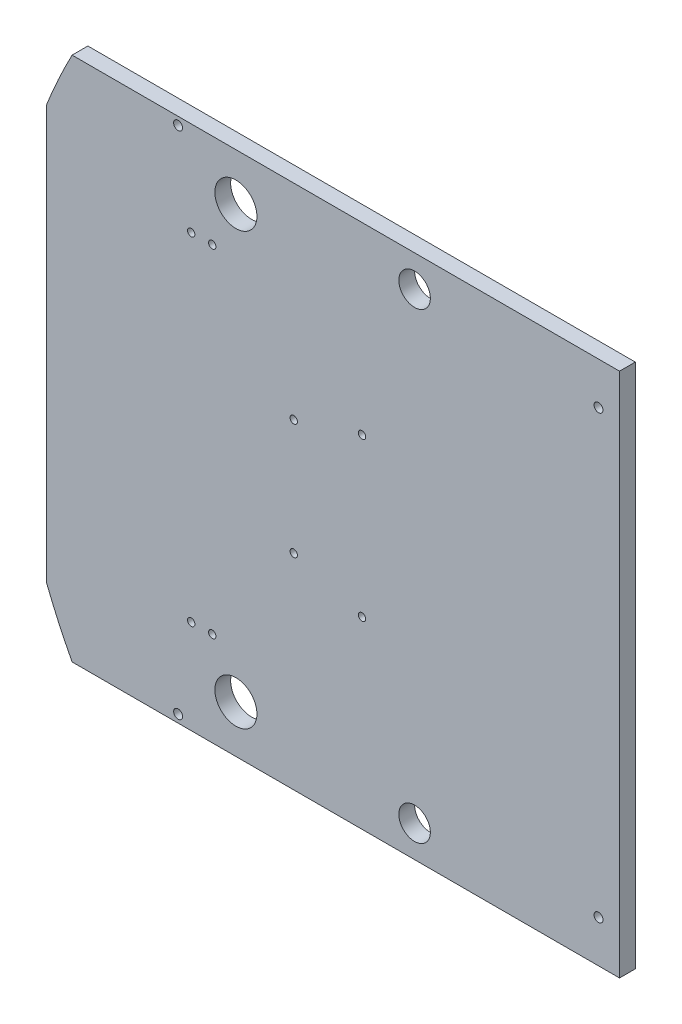
ISO-10303-21;
HEADER;
FILE_DESCRIPTION(('STEP AP214'),'2;1');
FILE_NAME('part.step','',(''),(''),'','','');
FILE_SCHEMA(('AUTOMOTIVE_DESIGN { 1 0 10303 214 1 1 1 1 }'));
ENDSEC;
DATA;
#1=APPLICATION_CONTEXT('core data for automotive mechanical design processes');
#2=APPLICATION_PROTOCOL_DEFINITION('international standard','automotive_design',2000,#1);
#3=PRODUCT_CONTEXT('',#1,'mechanical');
#4=PRODUCT('Part','Part','',(#3));
#5=PRODUCT_RELATED_PRODUCT_CATEGORY('part','',(#4));
#6=PRODUCT_DEFINITION_FORMATION('','',#4);
#7=PRODUCT_DEFINITION_CONTEXT('part definition',#1,'design');
#8=PRODUCT_DEFINITION('design','',#6,#7);
#9=PRODUCT_DEFINITION_SHAPE('','',#8);
#10=(LENGTH_UNIT() NAMED_UNIT(*) SI_UNIT(.MILLI.,.METRE.));
#11=(NAMED_UNIT(*) PLANE_ANGLE_UNIT() SI_UNIT($,.RADIAN.));
#12=(NAMED_UNIT(*) SI_UNIT($,.STERADIAN.) SOLID_ANGLE_UNIT());
#13=UNCERTAINTY_MEASURE_WITH_UNIT(LENGTH_MEASURE(1.E-05),#10,'distance_accuracy_value','');
#14=(GEOMETRIC_REPRESENTATION_CONTEXT(3) GLOBAL_UNCERTAINTY_ASSIGNED_CONTEXT((#13)) GLOBAL_UNIT_ASSIGNED_CONTEXT((#10,
#11,#12)) REPRESENTATION_CONTEXT('',''));
#15=CARTESIAN_POINT('',(0.,0.,0.));
#16=DIRECTION('',(0.,0.,1.));
#17=DIRECTION('',(1.,0.,0.));
#18=AXIS2_PLACEMENT_3D('',#15,#16,#17);
#19=CARTESIAN_POINT('',(10.,84.,239.3));
#20=DIRECTION('',(0.,0.,1.));
#21=DIRECTION('',(1.,0.,0.));
#22=AXIS2_PLACEMENT_3D('',#19,#20,#21);
#23=CYLINDRICAL_SURFACE('',#22,1.7);
#24=DIRECTION('',(0.,0.,1.));
#25=VECTOR('',#24,1.);
#26=CARTESIAN_POINT('',(11.7,84.,239.3));
#27=LINE('',#26,#25);
#28=CARTESIAN_POINT('',(11.7,84.,239.5));
#29=VERTEX_POINT('',#28);
#30=CARTESIAN_POINT('',(11.7,84.,245.5));
#31=VERTEX_POINT('',#30);
#32=EDGE_CURVE('E10',#29,#31,#27,.T.);
#33=ORIENTED_EDGE('',*,*,#32,.F.);
#34=CARTESIAN_POINT('',(10.,84.,239.5));
#35=DIRECTION('',(0.,0.,1.));
#36=DIRECTION('',(1.,0.,0.));
#37=AXIS2_PLACEMENT_3D('',#34,#35,#36);
#38=CIRCLE('',#37,1.7);
#39=EDGE_CURVE('E304',#29,#29,#38,.T.);
#40=ORIENTED_EDGE('',*,*,#39,.F.);
#41=ORIENTED_EDGE('',*,*,#32,.T.);
#42=CARTESIAN_POINT('',(10.,84.,245.5));
#43=DIRECTION('',(0.,0.,1.));
#44=DIRECTION('',(1.,0.,0.));
#45=AXIS2_PLACEMENT_3D('',#42,#43,#44);
#46=CIRCLE('',#45,1.7);
#47=EDGE_CURVE('E215',#31,#31,#46,.T.);
#48=ORIENTED_EDGE('',*,*,#47,.T.);
#49=EDGE_LOOP('',(#33,#40,#41,#48));
#50=FACE_BOUND('',#49,.T.);
#51=ADVANCED_FACE('F15',(#50),#23,.F.);
#52=CARTESIAN_POINT('',(-60.,88.,239.3));
#53=DIRECTION('',(0.,0.,1.));
#54=DIRECTION('',(1.,0.,0.));
#55=AXIS2_PLACEMENT_3D('',#52,#53,#54);
#56=CYLINDRICAL_SURFACE('',#55,6.);
#57=DIRECTION('',(0.,0.,1.));
#58=VECTOR('',#57,1.);
#59=CARTESIAN_POINT('',(-54.,88.,239.3));
#60=LINE('',#59,#58);
#61=CARTESIAN_POINT('',(-54.,88.,239.5));
#62=VERTEX_POINT('',#61);
#63=CARTESIAN_POINT('',(-54.,88.,245.5));
#64=VERTEX_POINT('',#63);
#65=EDGE_CURVE('E26',#62,#64,#60,.T.);
#66=ORIENTED_EDGE('',*,*,#65,.F.);
#67=CARTESIAN_POINT('',(-60.,88.,239.5));
#68=DIRECTION('',(0.,0.,1.));
#69=DIRECTION('',(1.,0.,0.));
#70=AXIS2_PLACEMENT_3D('',#67,#68,#69);
#71=CIRCLE('',#70,6.);
#72=EDGE_CURVE('E300',#62,#62,#71,.T.);
#73=ORIENTED_EDGE('',*,*,#72,.F.);
#74=ORIENTED_EDGE('',*,*,#65,.T.);
#75=CARTESIAN_POINT('',(-60.,88.,245.5));
#76=DIRECTION('',(0.,0.,1.));
#77=DIRECTION('',(1.,0.,0.));
#78=AXIS2_PLACEMENT_3D('',#75,#76,#77);
#79=CIRCLE('',#78,6.);
#80=EDGE_CURVE('E237',#64,#64,#79,.T.);
#81=ORIENTED_EDGE('',*,*,#80,.T.);
#82=EDGE_LOOP('',(#66,#73,#74,#81));
#83=FACE_BOUND('',#82,.T.);
#84=ADVANCED_FACE('F687',(#83),#56,.F.);
#85=CARTESIAN_POINT('',(-128.,82.,239.3));
#86=DIRECTION('',(0.,0.,1.));
#87=DIRECTION('',(1.,0.,0.));
#88=AXIS2_PLACEMENT_3D('',#85,#86,#87);
#89=CYLINDRICAL_SURFACE('',#88,8.);
#90=DIRECTION('',(0.,0.,1.));
#91=VECTOR('',#90,1.);
#92=CARTESIAN_POINT('',(-120.,82.,239.3));
#93=LINE('',#92,#91);
#94=CARTESIAN_POINT('',(-120.,82.,239.5));
#95=VERTEX_POINT('',#94);
#96=CARTESIAN_POINT('',(-120.,82.,245.5));
#97=VERTEX_POINT('',#96);
#98=EDGE_CURVE('E419',#95,#97,#93,.T.);
#99=ORIENTED_EDGE('',*,*,#98,.F.);
#100=CARTESIAN_POINT('',(-128.,82.,239.5));
#101=DIRECTION('',(0.,0.,1.));
#102=DIRECTION('',(1.,0.,0.));
#103=AXIS2_PLACEMENT_3D('',#100,#101,#102);
#104=CIRCLE('',#103,8.);
#105=EDGE_CURVE('E296',#95,#95,#104,.T.);
#106=ORIENTED_EDGE('',*,*,#105,.F.);
#107=ORIENTED_EDGE('',*,*,#98,.T.);
#108=CARTESIAN_POINT('',(-128.,82.,245.5));
#109=DIRECTION('',(0.,0.,1.));
#110=DIRECTION('',(1.,0.,0.));
#111=AXIS2_PLACEMENT_3D('',#108,#109,#110);
#112=CIRCLE('',#111,8.);
#113=EDGE_CURVE('E241',#97,#97,#112,.T.);
#114=ORIENTED_EDGE('',*,*,#113,.T.);
#115=EDGE_LOOP('',(#99,#106,#107,#114));
#116=FACE_BOUND('',#115,.T.);
#117=ADVANCED_FACE('F692',(#116),#89,.F.);
#118=CARTESIAN_POINT('',(-150.,97.,239.3));
#119=DIRECTION('',(0.,0.,1.));
#120=DIRECTION('',(1.,0.,0.));
#121=AXIS2_PLACEMENT_3D('',#118,#119,#120);
#122=CYLINDRICAL_SURFACE('',#121,1.7);
#123=DIRECTION('',(0.,0.,1.));
#124=VECTOR('',#123,1.);
#125=CARTESIAN_POINT('',(-148.3,97.,239.3));
#126=LINE('',#125,#124);
#127=CARTESIAN_POINT('',(-148.3,97.,239.5));
#128=VERTEX_POINT('',#127);
#129=CARTESIAN_POINT('',(-148.3,97.,245.5));
#130=VERTEX_POINT('',#129);
#131=EDGE_CURVE('E420',#128,#130,#126,.T.);
#132=ORIENTED_EDGE('',*,*,#131,.F.);
#133=CARTESIAN_POINT('',(-150.,97.,239.5));
#134=DIRECTION('',(0.,0.,1.));
#135=DIRECTION('',(1.,0.,0.));
#136=AXIS2_PLACEMENT_3D('',#133,#134,#135);
#137=CIRCLE('',#136,1.7);
#138=EDGE_CURVE('E252',#128,#128,#137,.T.);
#139=ORIENTED_EDGE('',*,*,#138,.F.);
#140=ORIENTED_EDGE('',*,*,#131,.T.);
#141=CARTESIAN_POINT('',(-150.,97.,245.5));
#142=DIRECTION('',(0.,0.,1.));
#143=DIRECTION('',(1.,0.,0.));
#144=AXIS2_PLACEMENT_3D('',#141,#142,#143);
#145=CIRCLE('',#144,1.7);
#146=EDGE_CURVE('E341',#130,#130,#145,.T.);
#147=ORIENTED_EDGE('',*,*,#146,.T.);
#148=EDGE_LOOP('',(#132,#139,#140,#147));
#149=FACE_BOUND('',#148,.T.);
#150=ADVANCED_FACE('F720',(#149),#122,.F.);
#151=CARTESIAN_POINT('',(-137.,64.2,239.4));
#152=DIRECTION('',(0.,0.,1.));
#153=DIRECTION('',(1.,0.,0.));
#154=AXIS2_PLACEMENT_3D('',#151,#152,#153);
#155=CYLINDRICAL_SURFACE('',#154,1.4);
#156=DIRECTION('',(0.,0.,1.));
#157=VECTOR('',#156,1.);
#158=CARTESIAN_POINT('',(-135.6,64.2,239.4));
#159=LINE('',#158,#157);
#160=CARTESIAN_POINT('',(-135.6,64.2,239.5));
#161=VERTEX_POINT('',#160);
#162=CARTESIAN_POINT('',(-135.6,64.2,245.5));
#163=VERTEX_POINT('',#162);
#164=EDGE_CURVE('E409',#161,#163,#159,.T.);
#165=ORIENTED_EDGE('',*,*,#164,.F.);
#166=CARTESIAN_POINT('',(-137.,64.2,239.5));
#167=DIRECTION('',(0.,0.,1.));
#168=DIRECTION('',(1.,0.,0.));
#169=AXIS2_PLACEMENT_3D('',#166,#167,#168);
#170=CIRCLE('',#169,1.4);
#171=EDGE_CURVE('E248',#161,#161,#170,.T.);
#172=ORIENTED_EDGE('',*,*,#171,.F.);
#173=ORIENTED_EDGE('',*,*,#164,.T.);
#174=CARTESIAN_POINT('',(-137.,64.2,245.5));
#175=DIRECTION('',(0.,0.,1.));
#176=DIRECTION('',(1.,0.,0.));
#177=AXIS2_PLACEMENT_3D('',#174,#175,#176);
#178=CIRCLE('',#177,1.4);
#179=EDGE_CURVE('E220',#163,#163,#178,.T.);
#180=ORIENTED_EDGE('',*,*,#179,.T.);
#181=EDGE_LOOP('',(#165,#172,#173,#180));
#182=FACE_BOUND('',#181,.T.);
#183=ADVANCED_FACE('F716',(#182),#155,.F.);
#184=CARTESIAN_POINT('',(-145.,64.2,239.4));
#185=DIRECTION('',(0.,0.,1.));
#186=DIRECTION('',(1.,0.,0.));
#187=AXIS2_PLACEMENT_3D('',#184,#185,#186);
#188=CYLINDRICAL_SURFACE('',#187,1.4);
#189=DIRECTION('',(0.,0.,1.));
#190=VECTOR('',#189,1.);
#191=CARTESIAN_POINT('',(-143.6,64.2,239.4));
#192=LINE('',#191,#190);
#193=CARTESIAN_POINT('',(-143.6,64.2,239.5));
#194=VERTEX_POINT('',#193);
#195=CARTESIAN_POINT('',(-143.6,64.2,245.5));
#196=VERTEX_POINT('',#195);
#197=EDGE_CURVE('E406',#194,#196,#192,.T.);
#198=ORIENTED_EDGE('',*,*,#197,.F.);
#199=CARTESIAN_POINT('',(-145.,64.2,239.5));
#200=DIRECTION('',(0.,0.,1.));
#201=DIRECTION('',(1.,0.,0.));
#202=AXIS2_PLACEMENT_3D('',#199,#200,#201);
#203=CIRCLE('',#202,1.4);
#204=EDGE_CURVE('E253',#194,#194,#203,.T.);
#205=ORIENTED_EDGE('',*,*,#204,.F.);
#206=ORIENTED_EDGE('',*,*,#197,.T.);
#207=CARTESIAN_POINT('',(-145.,64.2,245.5));
#208=DIRECTION('',(0.,0.,1.));
#209=DIRECTION('',(1.,0.,0.));
#210=AXIS2_PLACEMENT_3D('',#207,#208,#209);
#211=CIRCLE('',#210,1.4);
#212=EDGE_CURVE('E216',#196,#196,#211,.T.);
#213=ORIENTED_EDGE('',*,*,#212,.T.);
#214=EDGE_LOOP('',(#198,#205,#206,#213));
#215=FACE_BOUND('',#214,.T.);
#216=ADVANCED_FACE('F719',(#215),#188,.F.);
#217=CARTESIAN_POINT('',(-80.,30.,239.4));
#218=DIRECTION('',(0.,0.,1.));
#219=DIRECTION('',(1.,0.,0.));
#220=AXIS2_PLACEMENT_3D('',#217,#218,#219);
#221=CYLINDRICAL_SURFACE('',#220,1.4);
#222=DIRECTION('',(0.,0.,1.));
#223=VECTOR('',#222,1.);
#224=CARTESIAN_POINT('',(-78.6,30.,239.4));
#225=LINE('',#224,#223);
#226=CARTESIAN_POINT('',(-78.6,30.,239.5));
#227=VERTEX_POINT('',#226);
#228=CARTESIAN_POINT('',(-78.6,30.,245.5));
#229=VERTEX_POINT('',#228);
#230=EDGE_CURVE('E369',#227,#229,#225,.T.);
#231=ORIENTED_EDGE('',*,*,#230,.F.);
#232=CARTESIAN_POINT('',(-80.,30.,239.5));
#233=DIRECTION('',(0.,0.,1.));
#234=DIRECTION('',(1.,0.,0.));
#235=AXIS2_PLACEMENT_3D('',#232,#233,#234);
#236=CIRCLE('',#235,1.4);
#237=EDGE_CURVE('E311',#227,#227,#236,.T.);
#238=ORIENTED_EDGE('',*,*,#237,.F.);
#239=ORIENTED_EDGE('',*,*,#230,.T.);
#240=CARTESIAN_POINT('',(-80.,30.,245.5));
#241=DIRECTION('',(0.,0.,1.));
#242=DIRECTION('',(1.,0.,0.));
#243=AXIS2_PLACEMENT_3D('',#240,#241,#242);
#244=CIRCLE('',#243,1.4);
#245=EDGE_CURVE('E221',#229,#229,#244,.T.);
#246=ORIENTED_EDGE('',*,*,#245,.T.);
#247=EDGE_LOOP('',(#231,#238,#239,#246));
#248=FACE_BOUND('',#247,.T.);
#249=ADVANCED_FACE('F529',(#248),#221,.F.);
#250=CARTESIAN_POINT('',(-106.,22.,239.4));
#251=DIRECTION('',(0.,0.,1.));
#252=DIRECTION('',(1.,0.,0.));
#253=AXIS2_PLACEMENT_3D('',#250,#251,#252);
#254=CYLINDRICAL_SURFACE('',#253,1.4);
#255=DIRECTION('',(0.,0.,1.));
#256=VECTOR('',#255,1.);
#257=CARTESIAN_POINT('',(-104.6,22.,239.4));
#258=LINE('',#257,#256);
#259=CARTESIAN_POINT('',(-104.6,22.,239.5));
#260=VERTEX_POINT('',#259);
#261=CARTESIAN_POINT('',(-104.6,22.,245.5));
#262=VERTEX_POINT('',#261);
#263=EDGE_CURVE('E295',#260,#262,#258,.T.);
#264=ORIENTED_EDGE('',*,*,#263,.F.);
#265=CARTESIAN_POINT('',(-106.,22.,239.5));
#266=DIRECTION('',(0.,0.,1.));
#267=DIRECTION('',(1.,0.,0.));
#268=AXIS2_PLACEMENT_3D('',#265,#266,#267);
#269=CIRCLE('',#268,1.4);
#270=EDGE_CURVE('E316',#260,#260,#269,.T.);
#271=ORIENTED_EDGE('',*,*,#270,.F.);
#272=ORIENTED_EDGE('',*,*,#263,.T.);
#273=CARTESIAN_POINT('',(-106.,22.,245.5));
#274=DIRECTION('',(0.,0.,1.));
#275=DIRECTION('',(1.,0.,0.));
#276=AXIS2_PLACEMENT_3D('',#273,#274,#275);
#277=CIRCLE('',#276,1.4);
#278=EDGE_CURVE('E362',#262,#262,#277,.T.);
#279=ORIENTED_EDGE('',*,*,#278,.T.);
#280=EDGE_LOOP('',(#264,#271,#272,#279));
#281=FACE_BOUND('',#280,.T.);
#282=ADVANCED_FACE('F740',(#281),#254,.F.);
#283=CARTESIAN_POINT('',(10.,-84.,239.3));
#284=DIRECTION('',(0.,0.,1.));
#285=DIRECTION('',(1.,0.,0.));
#286=AXIS2_PLACEMENT_3D('',#283,#284,#285);
#287=CYLINDRICAL_SURFACE('',#286,1.7);
#288=DIRECTION('',(0.,0.,1.));
#289=VECTOR('',#288,1.);
#290=CARTESIAN_POINT('',(11.7,-84.,239.3));
#291=LINE('',#290,#289);
#292=CARTESIAN_POINT('',(11.7,-84.,239.5));
#293=VERTEX_POINT('',#292);
#294=CARTESIAN_POINT('',(11.7,-84.,245.5));
#295=VERTEX_POINT('',#294);
#296=EDGE_CURVE('E292',#293,#295,#291,.T.);
#297=ORIENTED_EDGE('',*,*,#296,.F.);
#298=CARTESIAN_POINT('',(10.,-84.,239.5));
#299=DIRECTION('',(0.,0.,1.));
#300=DIRECTION('',(1.,0.,0.));
#301=AXIS2_PLACEMENT_3D('',#298,#299,#300);
#302=CIRCLE('',#301,1.7);
#303=EDGE_CURVE('E312',#293,#293,#302,.T.);
#304=ORIENTED_EDGE('',*,*,#303,.F.);
#305=ORIENTED_EDGE('',*,*,#296,.T.);
#306=CARTESIAN_POINT('',(10.,-84.,245.5));
#307=DIRECTION('',(0.,0.,1.));
#308=DIRECTION('',(1.,0.,0.));
#309=AXIS2_PLACEMENT_3D('',#306,#307,#308);
#310=CIRCLE('',#309,1.7);
#311=EDGE_CURVE('E257',#295,#295,#310,.T.);
#312=ORIENTED_EDGE('',*,*,#311,.T.);
#313=EDGE_LOOP('',(#297,#304,#305,#312));
#314=FACE_BOUND('',#313,.T.);
#315=ADVANCED_FACE('F736',(#314),#287,.F.);
#316=CARTESIAN_POINT('',(-60.,-88.,239.3));
#317=DIRECTION('',(0.,0.,1.));
#318=DIRECTION('',(1.,0.,0.));
#319=AXIS2_PLACEMENT_3D('',#316,#317,#318);
#320=CYLINDRICAL_SURFACE('',#319,6.);
#321=DIRECTION('',(0.,0.,1.));
#322=VECTOR('',#321,1.);
#323=CARTESIAN_POINT('',(-54.,-88.,239.3));
#324=LINE('',#323,#322);
#325=CARTESIAN_POINT('',(-54.,-88.,239.5));
#326=VERTEX_POINT('',#325);
#327=CARTESIAN_POINT('',(-54.,-88.,245.5));
#328=VERTEX_POINT('',#327);
#329=EDGE_CURVE('E196',#326,#328,#324,.T.);
#330=ORIENTED_EDGE('',*,*,#329,.F.);
#331=CARTESIAN_POINT('',(-60.,-88.,239.5));
#332=DIRECTION('',(0.,0.,1.));
#333=DIRECTION('',(1.,0.,0.));
#334=AXIS2_PLACEMENT_3D('',#331,#332,#333);
#335=CIRCLE('',#334,6.);
#336=EDGE_CURVE('E317',#326,#326,#335,.T.);
#337=ORIENTED_EDGE('',*,*,#336,.F.);
#338=ORIENTED_EDGE('',*,*,#329,.T.);
#339=CARTESIAN_POINT('',(-60.,-88.,245.5));
#340=DIRECTION('',(0.,0.,1.));
#341=DIRECTION('',(1.,0.,0.));
#342=AXIS2_PLACEMENT_3D('',#339,#340,#341);
#343=CIRCLE('',#342,6.);
#344=EDGE_CURVE('E254',#328,#328,#343,.T.);
#345=ORIENTED_EDGE('',*,*,#344,.T.);
#346=EDGE_LOOP('',(#330,#337,#338,#345));
#347=FACE_BOUND('',#346,.T.);
#348=ADVANCED_FACE('F739',(#347),#320,.F.);
#349=CARTESIAN_POINT('',(-106.,-22.,239.4));
#350=DIRECTION('',(0.,0.,1.));
#351=DIRECTION('',(1.,0.,0.));
#352=AXIS2_PLACEMENT_3D('',#349,#350,#351);
#353=CYLINDRICAL_SURFACE('',#352,1.4);
#354=DIRECTION('',(0.,0.,1.));
#355=VECTOR('',#354,1.);
#356=CARTESIAN_POINT('',(-104.6,-22.,239.4));
#357=LINE('',#356,#355);
#358=CARTESIAN_POINT('',(-104.6,-22.,239.5));
#359=VERTEX_POINT('',#358);
#360=CARTESIAN_POINT('',(-104.6,-22.,245.5));
#361=VERTEX_POINT('',#360);
#362=EDGE_CURVE('E189',#359,#361,#357,.T.);
#363=ORIENTED_EDGE('',*,*,#362,.F.);
#364=CARTESIAN_POINT('',(-106.,-22.,239.5));
#365=DIRECTION('',(0.,0.,1.));
#366=DIRECTION('',(1.,0.,0.));
#367=AXIS2_PLACEMENT_3D('',#364,#365,#366);
#368=CIRCLE('',#367,1.4);
#369=EDGE_CURVE('E327',#359,#359,#368,.T.);
#370=ORIENTED_EDGE('',*,*,#369,.F.);
#371=ORIENTED_EDGE('',*,*,#362,.T.);
#372=CARTESIAN_POINT('',(-106.,-22.,245.5));
#373=DIRECTION('',(0.,0.,1.));
#374=DIRECTION('',(1.,0.,0.));
#375=AXIS2_PLACEMENT_3D('',#372,#373,#374);
#376=CIRCLE('',#375,1.4);
#377=EDGE_CURVE('E258',#361,#361,#376,.T.);
#378=ORIENTED_EDGE('',*,*,#377,.T.);
#379=EDGE_LOOP('',(#363,#370,#371,#378));
#380=FACE_BOUND('',#379,.T.);
#381=ADVANCED_FACE('F742',(#380),#353,.F.);
#382=CARTESIAN_POINT('',(-80.,-30.,239.4));
#383=DIRECTION('',(0.,0.,1.));
#384=DIRECTION('',(1.,0.,0.));
#385=AXIS2_PLACEMENT_3D('',#382,#383,#384);
#386=CYLINDRICAL_SURFACE('',#385,1.4);
#387=DIRECTION('',(0.,0.,1.));
#388=VECTOR('',#387,1.);
#389=CARTESIAN_POINT('',(-78.6,-30.,239.4));
#390=LINE('',#389,#388);
#391=CARTESIAN_POINT('',(-78.6,-30.,239.5));
#392=VERTEX_POINT('',#391);
#393=CARTESIAN_POINT('',(-78.6,-30.,245.5));
#394=VERTEX_POINT('',#393);
#395=EDGE_CURVE('E182',#392,#394,#390,.T.);
#396=ORIENTED_EDGE('',*,*,#395,.F.);
#397=CARTESIAN_POINT('',(-80.,-30.,239.5));
#398=DIRECTION('',(0.,0.,1.));
#399=DIRECTION('',(1.,0.,0.));
#400=AXIS2_PLACEMENT_3D('',#397,#398,#399);
#401=CIRCLE('',#400,1.4);
#402=EDGE_CURVE('E187',#392,#392,#401,.T.);
#403=ORIENTED_EDGE('',*,*,#402,.F.);
#404=ORIENTED_EDGE('',*,*,#395,.T.);
#405=CARTESIAN_POINT('',(-80.,-30.,245.5));
#406=DIRECTION('',(0.,0.,1.));
#407=DIRECTION('',(1.,0.,0.));
#408=AXIS2_PLACEMENT_3D('',#405,#406,#407);
#409=CIRCLE('',#408,1.4);
#410=EDGE_CURVE('E185',#394,#394,#409,.T.);
#411=ORIENTED_EDGE('',*,*,#410,.T.);
#412=EDGE_LOOP('',(#396,#403,#404,#411));
#413=FACE_BOUND('',#412,.T.);
#414=ADVANCED_FACE('F183',(#413),#386,.F.);
#415=CARTESIAN_POINT('',(-137.,-64.2,239.4));
#416=DIRECTION('',(0.,0.,1.));
#417=DIRECTION('',(1.,0.,0.));
#418=AXIS2_PLACEMENT_3D('',#415,#416,#417);
#419=CYLINDRICAL_SURFACE('',#418,1.4);
#420=DIRECTION('',(0.,0.,1.));
#421=VECTOR('',#420,1.);
#422=CARTESIAN_POINT('',(-135.6,-64.2,239.4));
#423=LINE('',#422,#421);
#424=CARTESIAN_POINT('',(-135.6,-64.2,239.5));
#425=VERTEX_POINT('',#424);
#426=CARTESIAN_POINT('',(-135.6,-64.2,245.5));
#427=VERTEX_POINT('',#426);
#428=EDGE_CURVE('E190',#425,#427,#423,.T.);
#429=ORIENTED_EDGE('',*,*,#428,.F.);
#430=CARTESIAN_POINT('',(-137.,-64.2,239.5));
#431=DIRECTION('',(0.,0.,1.));
#432=DIRECTION('',(1.,0.,0.));
#433=AXIS2_PLACEMENT_3D('',#430,#431,#432);
#434=CIRCLE('',#433,1.4);
#435=EDGE_CURVE('E226',#425,#425,#434,.T.);
#436=ORIENTED_EDGE('',*,*,#435,.F.);
#437=ORIENTED_EDGE('',*,*,#428,.T.);
#438=CARTESIAN_POINT('',(-137.,-64.2,245.5));
#439=DIRECTION('',(0.,0.,1.));
#440=DIRECTION('',(1.,0.,0.));
#441=AXIS2_PLACEMENT_3D('',#438,#439,#440);
#442=CIRCLE('',#441,1.4);
#443=EDGE_CURVE('E235',#427,#427,#442,.T.);
#444=ORIENTED_EDGE('',*,*,#443,.T.);
#445=EDGE_LOOP('',(#429,#436,#437,#444));
#446=FACE_BOUND('',#445,.T.);
#447=ADVANCED_FACE('F826',(#446),#419,.F.);
#448=CARTESIAN_POINT('',(-145.,-64.2,239.4));
#449=DIRECTION('',(0.,0.,1.));
#450=DIRECTION('',(1.,0.,0.));
#451=AXIS2_PLACEMENT_3D('',#448,#449,#450);
#452=CYLINDRICAL_SURFACE('',#451,1.4);
#453=DIRECTION('',(0.,0.,1.));
#454=VECTOR('',#453,1.);
#455=CARTESIAN_POINT('',(-143.6,-64.2,239.4));
#456=LINE('',#455,#454);
#457=CARTESIAN_POINT('',(-143.6,-64.2,239.5));
#458=VERTEX_POINT('',#457);
#459=CARTESIAN_POINT('',(-143.6,-64.2,245.5));
#460=VERTEX_POINT('',#459);
#461=EDGE_CURVE('E199',#458,#460,#456,.T.);
#462=ORIENTED_EDGE('',*,*,#461,.F.);
#463=CARTESIAN_POINT('',(-145.,-64.2,239.5));
#464=DIRECTION('',(0.,0.,1.));
#465=DIRECTION('',(1.,0.,0.));
#466=AXIS2_PLACEMENT_3D('',#463,#464,#465);
#467=CIRCLE('',#466,1.4);
#468=EDGE_CURVE('E230',#458,#458,#467,.T.);
#469=ORIENTED_EDGE('',*,*,#468,.F.);
#470=ORIENTED_EDGE('',*,*,#461,.T.);
#471=CARTESIAN_POINT('',(-145.,-64.2,245.5));
#472=DIRECTION('',(0.,0.,1.));
#473=DIRECTION('',(1.,0.,0.));
#474=AXIS2_PLACEMENT_3D('',#471,#472,#473);
#475=CIRCLE('',#474,1.4);
#476=EDGE_CURVE('E231',#460,#460,#475,.T.);
#477=ORIENTED_EDGE('',*,*,#476,.T.);
#478=EDGE_LOOP('',(#462,#469,#470,#477));
#479=FACE_BOUND('',#478,.T.);
#480=ADVANCED_FACE('F699',(#479),#452,.F.);
#481=CARTESIAN_POINT('',(-128.,-82.,239.3));
#482=DIRECTION('',(0.,0.,1.));
#483=DIRECTION('',(1.,0.,0.));
#484=AXIS2_PLACEMENT_3D('',#481,#482,#483);
#485=CYLINDRICAL_SURFACE('',#484,8.);
#486=DIRECTION('',(0.,0.,1.));
#487=VECTOR('',#486,1.);
#488=CARTESIAN_POINT('',(-120.,-82.,239.3));
#489=LINE('',#488,#487);
#490=CARTESIAN_POINT('',(-120.,-82.,239.5));
#491=VERTEX_POINT('',#490);
#492=CARTESIAN_POINT('',(-120.,-82.,245.5));
#493=VERTEX_POINT('',#492);
#494=EDGE_CURVE('E351',#491,#493,#489,.T.);
#495=ORIENTED_EDGE('',*,*,#494,.F.);
#496=CARTESIAN_POINT('',(-128.,-82.,239.5));
#497=DIRECTION('',(0.,0.,1.));
#498=DIRECTION('',(1.,0.,0.));
#499=AXIS2_PLACEMENT_3D('',#496,#497,#498);
#500=CIRCLE('',#499,8.);
#501=EDGE_CURVE('E404',#491,#491,#500,.T.);
#502=ORIENTED_EDGE('',*,*,#501,.F.);
#503=ORIENTED_EDGE('',*,*,#494,.T.);
#504=CARTESIAN_POINT('',(-128.,-82.,245.5));
#505=DIRECTION('',(0.,0.,1.));
#506=DIRECTION('',(1.,0.,0.));
#507=AXIS2_PLACEMENT_3D('',#504,#505,#506);
#508=CIRCLE('',#507,8.);
#509=EDGE_CURVE('E236',#493,#493,#508,.T.);
#510=ORIENTED_EDGE('',*,*,#509,.T.);
#511=EDGE_LOOP('',(#495,#502,#503,#510));
#512=FACE_BOUND('',#511,.T.);
#513=ADVANCED_FACE('F697',(#512),#485,.F.);
#514=CARTESIAN_POINT('',(-150.,-97.,239.3));
#515=DIRECTION('',(0.,0.,1.));
#516=DIRECTION('',(1.,0.,0.));
#517=AXIS2_PLACEMENT_3D('',#514,#515,#516);
#518=CYLINDRICAL_SURFACE('',#517,1.7);
#519=DIRECTION('',(0.,0.,1.));
#520=VECTOR('',#519,1.);
#521=CARTESIAN_POINT('',(-148.3,-97.,239.3));
#522=LINE('',#521,#520);
#523=CARTESIAN_POINT('',(-148.3,-97.,239.5));
#524=VERTEX_POINT('',#523);
#525=CARTESIAN_POINT('',(-148.3,-97.,245.5));
#526=VERTEX_POINT('',#525);
#527=EDGE_CURVE('E272',#524,#526,#522,.T.);
#528=ORIENTED_EDGE('',*,*,#527,.F.);
#529=CARTESIAN_POINT('',(-150.,-97.,239.5));
#530=DIRECTION('',(0.,0.,1.));
#531=DIRECTION('',(1.,0.,0.));
#532=AXIS2_PLACEMENT_3D('',#529,#530,#531);
#533=CIRCLE('',#532,1.7);
#534=EDGE_CURVE('E400',#524,#524,#533,.T.);
#535=ORIENTED_EDGE('',*,*,#534,.F.);
#536=ORIENTED_EDGE('',*,*,#527,.T.);
#537=CARTESIAN_POINT('',(-150.,-97.,245.5));
#538=DIRECTION('',(0.,0.,1.));
#539=DIRECTION('',(1.,0.,0.));
#540=AXIS2_PLACEMENT_3D('',#537,#538,#539);
#541=CIRCLE('',#540,1.7);
#542=EDGE_CURVE('E290',#526,#526,#541,.T.);
#543=ORIENTED_EDGE('',*,*,#542,.T.);
#544=EDGE_LOOP('',(#528,#535,#536,#543));
#545=FACE_BOUND('',#544,.T.);
#546=ADVANCED_FACE('F560',(#545),#518,.F.);
#547=CARTESIAN_POINT('',(-200.,-78.89810133986,239.5));
#548=DIRECTION('',(0.925459729868298,0.378845995613122,0.));
#549=DIRECTION('',(0.,0.,-1.));
#550=AXIS2_PLACEMENT_3D('',#547,#548,#549);
#551=PLANE('',#550);
#552=DIRECTION('',(0.378845995613122,-0.925459729868298,0.));
#553=VECTOR('',#552,1.);
#554=CARTESIAN_POINT('',(-200.,-78.89810133986,239.5));
#555=LINE('',#554,#553);
#556=CARTESIAN_POINT('',(-200.,-78.89810133986,239.5));
#557=VERTEX_POINT('',#556);
#558=CARTESIAN_POINT('',(-197.9085434922,-84.00719262519,239.5));
#559=VERTEX_POINT('',#558);
#560=EDGE_CURVE('E321',#557,#559,#555,.T.);
#561=ORIENTED_EDGE('',*,*,#560,.T.);
#562=DIRECTION('',(0.,0.,1.));
#563=VECTOR('',#562,1.);
#564=CARTESIAN_POINT('',(-197.9085434922,-84.00719262519,239.5));
#565=LINE('',#564,#563);
#566=CARTESIAN_POINT('',(-197.9085434922,-84.00719262519,245.5));
#567=VERTEX_POINT('',#566);
#568=EDGE_CURVE('E259',#559,#567,#565,.T.);
#569=ORIENTED_EDGE('',*,*,#568,.T.);
#570=DIRECTION('',(0.378845995613122,-0.925459729868298,0.));
#571=VECTOR('',#570,1.);
#572=CARTESIAN_POINT('',(-200.,-78.89810133986,245.5));
#573=LINE('',#572,#571);
#574=CARTESIAN_POINT('',(-200.,-78.89810133986,245.5));
#575=VERTEX_POINT('',#574);
#576=EDGE_CURVE('E340',#575,#567,#573,.T.);
#577=ORIENTED_EDGE('',*,*,#576,.F.);
#578=DIRECTION('',(0.,0.,1.));
#579=VECTOR('',#578,1.);
#580=CARTESIAN_POINT('',(-200.,-78.89810133986,239.5));
#581=LINE('',#580,#579);
#582=EDGE_CURVE('E262',#557,#575,#581,.T.);
#583=ORIENTED_EDGE('',*,*,#582,.F.);
#584=EDGE_LOOP('',(#561,#569,#577,#583));
#585=FACE_BOUND('',#584,.T.);
#586=ADVANCED_FACE('F702',(#585),#551,.F.);
#587=CARTESIAN_POINT('',(-200.,78.898101339862,239.5));
#588=DIRECTION('',(1.,0.,0.));
#589=DIRECTION('',(0.,1.,0.));
#590=AXIS2_PLACEMENT_3D('',#587,#588,#589);
#591=PLANE('',#590);
#592=DIRECTION('',(0.,-1.,0.));
#593=VECTOR('',#592,1.);
#594=CARTESIAN_POINT('',(-200.,78.898101339862,239.5));
#595=LINE('',#594,#593);
#596=CARTESIAN_POINT('',(-200.,78.898101339862,239.5));
#597=VERTEX_POINT('',#596);
#598=EDGE_CURVE('E326',#597,#557,#595,.T.);
#599=ORIENTED_EDGE('',*,*,#598,.T.);
#600=ORIENTED_EDGE('',*,*,#582,.T.);
#601=DIRECTION('',(0.,-1.,0.));
#602=VECTOR('',#601,1.);
#603=CARTESIAN_POINT('',(-200.,78.898101339862,245.5));
#604=LINE('',#603,#602);
#605=CARTESIAN_POINT('',(-200.,78.898101339862,245.5));
#606=VERTEX_POINT('',#605);
#607=EDGE_CURVE('E373',#606,#575,#604,.T.);
#608=ORIENTED_EDGE('',*,*,#607,.F.);
#609=DIRECTION('',(0.,0.,1.));
#610=VECTOR('',#609,1.);
#611=CARTESIAN_POINT('',(-200.,78.898101339862,239.5));
#612=LINE('',#611,#610);
#613=EDGE_CURVE('E263',#597,#606,#612,.T.);
#614=ORIENTED_EDGE('',*,*,#613,.F.);
#615=EDGE_LOOP('',(#599,#600,#608,#614));
#616=FACE_BOUND('',#615,.T.);
#617=ADVANCED_FACE('F706',(#616),#591,.F.);
#618=CARTESIAN_POINT('',(-197.9085434922,-84.00719262519,239.5));
#619=DIRECTION('',(0.915311479119278,0.402746689859122,0.));
#620=DIRECTION('',(0.,0.,-1.));
#621=AXIS2_PLACEMENT_3D('',#618,#619,#620);
#622=PLANE('',#621);
#623=DIRECTION('',(0.402746689859122,-0.915311479119278,0.));
#624=VECTOR('',#623,1.);
#625=CARTESIAN_POINT('',(-197.9085434922,-84.00719262519,239.5));
#626=LINE('',#625,#624);
#627=CARTESIAN_POINT('',(-195.6416732384,-89.15904717109,239.5));
#628=VERTEX_POINT('',#627);
#629=EDGE_CURVE('E208',#559,#628,#626,.T.);
#630=ORIENTED_EDGE('',*,*,#629,.T.);
#631=DIRECTION('',(0.,0.,1.));
#632=VECTOR('',#631,1.);
#633=CARTESIAN_POINT('',(-195.6416732384,-89.15904717109,239.5));
#634=LINE('',#633,#632);
#635=CARTESIAN_POINT('',(-195.6416732384,-89.15904717109,245.5));
#636=VERTEX_POINT('',#635);
#637=EDGE_CURVE('E276',#628,#636,#634,.T.);
#638=ORIENTED_EDGE('',*,*,#637,.T.);
#639=DIRECTION('',(0.402746689859122,-0.915311479119278,0.));
#640=VECTOR('',#639,1.);
#641=CARTESIAN_POINT('',(-197.9085434922,-84.00719262519,245.5));
#642=LINE('',#641,#640);
#643=EDGE_CURVE('E246',#567,#636,#642,.T.);
#644=ORIENTED_EDGE('',*,*,#643,.F.);
#645=ORIENTED_EDGE('',*,*,#568,.F.);
#646=EDGE_LOOP('',(#630,#638,#644,#645));
#647=FACE_BOUND('',#646,.T.);
#648=ADVANCED_FACE('F711',(#647),#622,.F.);
#649=CARTESIAN_POINT('',(-197.9085434922,84.007192625194,239.5));
#650=DIRECTION('',(0.925459729868298,-0.378845995613122,0.));
#651=DIRECTION('',(0.,0.,-1.));
#652=AXIS2_PLACEMENT_3D('',#649,#650,#651);
#653=PLANE('',#652);
#654=DIRECTION('',(-0.378845995613122,-0.925459729868298,0.));
#655=VECTOR('',#654,1.);
#656=CARTESIAN_POINT('',(-197.9085434922,84.007192625194,239.5));
#657=LINE('',#656,#655);
#658=CARTESIAN_POINT('',(-197.9085434922,84.007192625194,239.5));
#659=VERTEX_POINT('',#658);
#660=EDGE_CURVE('E322',#659,#597,#657,.T.);
#661=ORIENTED_EDGE('',*,*,#660,.T.);
#662=ORIENTED_EDGE('',*,*,#613,.T.);
#663=DIRECTION('',(-0.378845995613122,-0.925459729868298,0.));
#664=VECTOR('',#663,1.);
#665=CARTESIAN_POINT('',(-197.9085434922,84.007192625194,245.5));
#666=LINE('',#665,#664);
#667=CARTESIAN_POINT('',(-197.9085434922,84.007192625194,245.5));
#668=VERTEX_POINT('',#667);
#669=EDGE_CURVE('E335',#668,#606,#666,.T.);
#670=ORIENTED_EDGE('',*,*,#669,.F.);
#671=DIRECTION('',(0.,0.,1.));
#672=VECTOR('',#671,1.);
#673=CARTESIAN_POINT('',(-197.9085434922,84.007192625194,239.5));
#674=LINE('',#673,#672);
#675=EDGE_CURVE('E286',#659,#668,#674,.T.);
#676=ORIENTED_EDGE('',*,*,#675,.F.);
#677=EDGE_LOOP('',(#661,#662,#670,#676));
#678=FACE_BOUND('',#677,.T.);
#679=ADVANCED_FACE('F640',(#678),#653,.F.);
#680=CARTESIAN_POINT('',(-195.6416732384,-89.15904717109,239.5));
#681=DIRECTION('',(0.904455145454478,0.426568739901225,0.));
#682=DIRECTION('',(0.,0.,-1.));
#683=AXIS2_PLACEMENT_3D('',#680,#681,#682);
#684=PLANE('',#683);
#685=DIRECTION('',(0.426568739901225,-0.904455145454478,0.));
#686=VECTOR('',#685,1.);
#687=CARTESIAN_POINT('',(-195.6416732384,-89.15904717109,239.5));
#688=LINE('',#687,#686);
#689=CARTESIAN_POINT('',(-193.2407199543,-94.24979655965,239.5));
#690=VERTEX_POINT('',#689);
#691=EDGE_CURVE('E205',#628,#690,#688,.T.);
#692=ORIENTED_EDGE('',*,*,#691,.T.);
#693=DIRECTION('',(0.,0.,1.));
#694=VECTOR('',#693,1.);
#695=CARTESIAN_POINT('',(-193.2407199543,-94.24979655965,239.5));
#696=LINE('',#695,#694);
#697=CARTESIAN_POINT('',(-193.2407199543,-94.24979655965,245.5));
#698=VERTEX_POINT('',#697);
#699=EDGE_CURVE('E225',#690,#698,#696,.T.);
#700=ORIENTED_EDGE('',*,*,#699,.T.);
#701=DIRECTION('',(0.426568739901225,-0.904455145454478,0.));
#702=VECTOR('',#701,1.);
#703=CARTESIAN_POINT('',(-195.6416732384,-89.15904717109,245.5));
#704=LINE('',#703,#702);
#705=EDGE_CURVE('E242',#636,#698,#704,.T.);
#706=ORIENTED_EDGE('',*,*,#705,.F.);
#707=ORIENTED_EDGE('',*,*,#637,.F.);
#708=EDGE_LOOP('',(#692,#700,#706,#707));
#709=FACE_BOUND('',#708,.T.);
#710=ADVANCED_FACE('F17',(#709),#684,.F.);
#711=CARTESIAN_POINT('',(-195.6416732384,89.159047171091,239.5));
#712=DIRECTION('',(0.915311479119278,-0.402746689859122,0.));
#713=DIRECTION('',(0.,0.,-1.));
#714=AXIS2_PLACEMENT_3D('',#711,#712,#713);
#715=PLANE('',#714);
#716=DIRECTION('',(-0.402746689859122,-0.915311479119278,0.));
#717=VECTOR('',#716,1.);
#718=CARTESIAN_POINT('',(-195.6416732384,89.159047171091,239.5));
#719=LINE('',#718,#717);
#720=CARTESIAN_POINT('',(-195.6416732384,89.159047171091,239.5));
#721=VERTEX_POINT('',#720);
#722=EDGE_CURVE('E325',#721,#659,#719,.T.);
#723=ORIENTED_EDGE('',*,*,#722,.T.);
#724=ORIENTED_EDGE('',*,*,#675,.T.);
#725=DIRECTION('',(-0.402746689859122,-0.915311479119278,0.));
#726=VECTOR('',#725,1.);
#727=CARTESIAN_POINT('',(-195.6416732384,89.159047171091,245.5));
#728=LINE('',#727,#726);
#729=CARTESIAN_POINT('',(-195.6416732384,89.159047171091,245.5));
#730=VERTEX_POINT('',#729);
#731=EDGE_CURVE('E331',#730,#668,#728,.T.);
#732=ORIENTED_EDGE('',*,*,#731,.F.);
#733=DIRECTION('',(0.,0.,1.));
#734=VECTOR('',#733,1.);
#735=CARTESIAN_POINT('',(-195.6416732384,89.159047171091,239.5));
#736=LINE('',#735,#734);
#737=EDGE_CURVE('E214',#721,#730,#736,.T.);
#738=ORIENTED_EDGE('',*,*,#737,.F.);
#739=EDGE_LOOP('',(#723,#724,#732,#738));
#740=FACE_BOUND('',#739,.T.);
#741=ADVANCED_FACE('F632',(#740),#715,.F.);
#742=CARTESIAN_POINT('',(-193.2407199543,-94.24979655965,239.5));
#743=DIRECTION('',(0.892105820085702,0.451826521763849,0.));
#744=DIRECTION('',(0.,0.,-1.));
#745=AXIS2_PLACEMENT_3D('',#742,#743,#744);
#746=PLANE('',#745);
#747=DIRECTION('',(0.451826521763849,-0.892105820085702,0.));
#748=VECTOR('',#747,1.);
#749=CARTESIAN_POINT('',(-193.2407199543,-94.24979655965,239.5));
#750=LINE('',#749,#748);
#751=CARTESIAN_POINT('',(-190.3284035436,-100.,239.5));
#752=VERTEX_POINT('',#751);
#753=EDGE_CURVE('E209',#690,#752,#750,.T.);
#754=ORIENTED_EDGE('',*,*,#753,.T.);
#755=DIRECTION('',(0.,0.,1.));
#756=VECTOR('',#755,1.);
#757=CARTESIAN_POINT('',(-190.3284035436,-100.,239.5));
#758=LINE('',#757,#756);
#759=CARTESIAN_POINT('',(-190.3284035436,-100.,245.5));
#760=VERTEX_POINT('',#759);
#761=EDGE_CURVE('E210',#752,#760,#758,.T.);
#762=ORIENTED_EDGE('',*,*,#761,.T.);
#763=DIRECTION('',(0.451826521763849,-0.892105820085702,0.));
#764=VECTOR('',#763,1.);
#765=CARTESIAN_POINT('',(-193.2407199543,-94.24979655965,245.5));
#766=LINE('',#765,#764);
#767=EDGE_CURVE('E245',#698,#760,#766,.T.);
#768=ORIENTED_EDGE('',*,*,#767,.F.);
#769=ORIENTED_EDGE('',*,*,#699,.F.);
#770=EDGE_LOOP('',(#754,#762,#768,#769));
#771=FACE_BOUND('',#770,.T.);
#772=ADVANCED_FACE('F732',(#771),#746,.F.);
#773=CARTESIAN_POINT('',(-193.2407199543,94.249796559652,239.5));
#774=DIRECTION('',(0.904455145454478,-0.426568739901225,0.));
#775=DIRECTION('',(0.,0.,-1.));
#776=AXIS2_PLACEMENT_3D('',#773,#774,#775);
#777=PLANE('',#776);
#778=DIRECTION('',(-0.426568739901225,-0.904455145454478,0.));
#779=VECTOR('',#778,1.);
#780=CARTESIAN_POINT('',(-193.2407199543,94.249796559652,239.5));
#781=LINE('',#780,#779);
#782=CARTESIAN_POINT('',(-193.2407199543,94.249796559652,239.5));
#783=VERTEX_POINT('',#782);
#784=EDGE_CURVE('E405',#783,#721,#781,.T.);
#785=ORIENTED_EDGE('',*,*,#784,.T.);
#786=ORIENTED_EDGE('',*,*,#737,.T.);
#787=DIRECTION('',(-0.426568739901225,-0.904455145454478,0.));
#788=VECTOR('',#787,1.);
#789=CARTESIAN_POINT('',(-193.2407199543,94.249796559652,245.5));
#790=LINE('',#789,#788);
#791=CARTESIAN_POINT('',(-193.2407199543,94.249796559652,245.5));
#792=VERTEX_POINT('',#791);
#793=EDGE_CURVE('E336',#792,#730,#790,.T.);
#794=ORIENTED_EDGE('',*,*,#793,.F.);
#795=DIRECTION('',(0.,0.,1.));
#796=VECTOR('',#795,1.);
#797=CARTESIAN_POINT('',(-193.2407199543,94.249796559652,239.5));
#798=LINE('',#797,#796);
#799=EDGE_CURVE('E458',#783,#792,#798,.T.);
#800=ORIENTED_EDGE('',*,*,#799,.F.);
#801=EDGE_LOOP('',(#785,#786,#794,#800));
#802=FACE_BOUND('',#801,.T.);
#803=ADVANCED_FACE('F636',(#802),#777,.F.);
#804=CARTESIAN_POINT('',(-190.3284035436,-100.,239.5));
#805=DIRECTION('',(0.,1.,0.));
#806=DIRECTION('',(1.,0.,0.));
#807=AXIS2_PLACEMENT_3D('',#804,#805,#806);
#808=PLANE('',#807);
#809=DIRECTION('',(1.,0.,0.));
#810=VECTOR('',#809,1.);
#811=CARTESIAN_POINT('',(-190.3284035436,-100.,239.5));
#812=LINE('',#811,#810);
#813=CARTESIAN_POINT('',(18.,-100.,239.5));
#814=VERTEX_POINT('',#813);
#815=EDGE_CURVE('E413',#752,#814,#812,.T.);
#816=ORIENTED_EDGE('',*,*,#815,.T.);
#817=DIRECTION('',(0.,0.,1.));
#818=VECTOR('',#817,1.);
#819=CARTESIAN_POINT('',(18.,-100.,239.5));
#820=LINE('',#819,#818);
#821=CARTESIAN_POINT('',(18.,-100.,245.5));
#822=VERTEX_POINT('',#821);
#823=EDGE_CURVE('E203',#814,#822,#820,.T.);
#824=ORIENTED_EDGE('',*,*,#823,.T.);
#825=DIRECTION('',(1.,0.,0.));
#826=VECTOR('',#825,1.);
#827=CARTESIAN_POINT('',(-190.3284035436,-100.,245.5));
#828=LINE('',#827,#826);
#829=EDGE_CURVE('E305',#760,#822,#828,.T.);
#830=ORIENTED_EDGE('',*,*,#829,.F.);
#831=ORIENTED_EDGE('',*,*,#761,.F.);
#832=EDGE_LOOP('',(#816,#824,#830,#831));
#833=FACE_BOUND('',#832,.T.);
#834=ADVANCED_FACE('F498',(#833),#808,.F.);
#835=CARTESIAN_POINT('',(-88.84537039525,0.,245.5));
#836=DIRECTION('',(0.,0.,1.));
#837=DIRECTION('',(1.,0.,0.));
#838=AXIS2_PLACEMENT_3D('',#835,#836,#837);
#839=PLANE('',#838);
#840=ORIENTED_EDGE('',*,*,#47,.F.);
#841=EDGE_LOOP('',(#840));
#842=FACE_BOUND('',#841,.T.);
#843=ORIENTED_EDGE('',*,*,#80,.F.);
#844=EDGE_LOOP('',(#843));
#845=FACE_BOUND('',#844,.T.);
#846=ORIENTED_EDGE('',*,*,#113,.F.);
#847=EDGE_LOOP('',(#846));
#848=FACE_BOUND('',#847,.T.);
#849=ORIENTED_EDGE('',*,*,#146,.F.);
#850=EDGE_LOOP('',(#849));
#851=FACE_BOUND('',#850,.T.);
#852=ORIENTED_EDGE('',*,*,#179,.F.);
#853=EDGE_LOOP('',(#852));
#854=FACE_BOUND('',#853,.T.);
#855=ORIENTED_EDGE('',*,*,#212,.F.);
#856=EDGE_LOOP('',(#855));
#857=FACE_BOUND('',#856,.T.);
#858=ORIENTED_EDGE('',*,*,#245,.F.);
#859=EDGE_LOOP('',(#858));
#860=FACE_BOUND('',#859,.T.);
#861=ORIENTED_EDGE('',*,*,#278,.F.);
#862=EDGE_LOOP('',(#861));
#863=FACE_BOUND('',#862,.T.);
#864=ORIENTED_EDGE('',*,*,#311,.F.);
#865=EDGE_LOOP('',(#864));
#866=FACE_BOUND('',#865,.T.);
#867=ORIENTED_EDGE('',*,*,#344,.F.);
#868=EDGE_LOOP('',(#867));
#869=FACE_BOUND('',#868,.T.);
#870=ORIENTED_EDGE('',*,*,#377,.F.);
#871=EDGE_LOOP('',(#870));
#872=FACE_BOUND('',#871,.T.);
#873=ORIENTED_EDGE('',*,*,#410,.F.);
#874=EDGE_LOOP('',(#873));
#875=FACE_BOUND('',#874,.T.);
#876=ORIENTED_EDGE('',*,*,#443,.F.);
#877=EDGE_LOOP('',(#876));
#878=FACE_BOUND('',#877,.T.);
#879=ORIENTED_EDGE('',*,*,#476,.F.);
#880=EDGE_LOOP('',(#879));
#881=FACE_BOUND('',#880,.T.);
#882=ORIENTED_EDGE('',*,*,#509,.F.);
#883=EDGE_LOOP('',(#882));
#884=FACE_BOUND('',#883,.T.);
#885=ORIENTED_EDGE('',*,*,#542,.F.);
#886=EDGE_LOOP('',(#885));
#887=FACE_BOUND('',#886,.T.);
#888=DIRECTION('',(-1.,0.,0.));
#889=VECTOR('',#888,1.);
#890=CARTESIAN_POINT('',(18.,100.,245.5));
#891=LINE('',#890,#889);
#892=CARTESIAN_POINT('',(18.,100.,245.5));
#893=VERTEX_POINT('',#892);
#894=CARTESIAN_POINT('',(-190.3284035436,100.,245.5));
#895=VERTEX_POINT('',#894);
#896=EDGE_CURVE('E358',#893,#895,#891,.T.);
#897=ORIENTED_EDGE('',*,*,#896,.T.);
#898=DIRECTION('',(-0.451826521763849,-0.892105820085702,0.));
#899=VECTOR('',#898,1.);
#900=CARTESIAN_POINT('',(-190.3284035436,100.,245.5));
#901=LINE('',#900,#899);
#902=EDGE_CURVE('E19',#895,#792,#901,.T.);
#903=ORIENTED_EDGE('',*,*,#902,.T.);
#904=ORIENTED_EDGE('',*,*,#793,.T.);
#905=ORIENTED_EDGE('',*,*,#731,.T.);
#906=ORIENTED_EDGE('',*,*,#669,.T.);
#907=ORIENTED_EDGE('',*,*,#607,.T.);
#908=ORIENTED_EDGE('',*,*,#576,.T.);
#909=ORIENTED_EDGE('',*,*,#643,.T.);
#910=ORIENTED_EDGE('',*,*,#705,.T.);
#911=ORIENTED_EDGE('',*,*,#767,.T.);
#912=ORIENTED_EDGE('',*,*,#829,.T.);
#913=DIRECTION('',(0.,1.,0.));
#914=VECTOR('',#913,1.);
#915=CARTESIAN_POINT('',(18.,-100.,245.5));
#916=LINE('',#915,#914);
#917=EDGE_CURVE('E348',#822,#893,#916,.T.);
#918=ORIENTED_EDGE('',*,*,#917,.T.);
#919=EDGE_LOOP('',(#897,#903,#904,#905,#906,#907,#908,#909,#910,#911,#912,#918));
#920=FACE_BOUND('',#919,.T.);
#921=ADVANCED_FACE('F532',(#842,#845,#848,#851,#854,#857,#860,#863,#866,#869,#872,#875,#878,
#881,#884,#887,#920),#839,.T.);
#922=CARTESIAN_POINT('',(-88.84537039525,0.,239.5));
#923=DIRECTION('',(0.,0.,1.));
#924=DIRECTION('',(1.,0.,0.));
#925=AXIS2_PLACEMENT_3D('',#922,#923,#924);
#926=PLANE('',#925);
#927=ORIENTED_EDGE('',*,*,#39,.T.);
#928=EDGE_LOOP('',(#927));
#929=FACE_BOUND('',#928,.T.);
#930=ORIENTED_EDGE('',*,*,#72,.T.);
#931=EDGE_LOOP('',(#930));
#932=FACE_BOUND('',#931,.T.);
#933=ORIENTED_EDGE('',*,*,#105,.T.);
#934=EDGE_LOOP('',(#933));
#935=FACE_BOUND('',#934,.T.);
#936=ORIENTED_EDGE('',*,*,#138,.T.);
#937=EDGE_LOOP('',(#936));
#938=FACE_BOUND('',#937,.T.);
#939=ORIENTED_EDGE('',*,*,#171,.T.);
#940=EDGE_LOOP('',(#939));
#941=FACE_BOUND('',#940,.T.);
#942=ORIENTED_EDGE('',*,*,#204,.T.);
#943=EDGE_LOOP('',(#942));
#944=FACE_BOUND('',#943,.T.);
#945=ORIENTED_EDGE('',*,*,#237,.T.);
#946=EDGE_LOOP('',(#945));
#947=FACE_BOUND('',#946,.T.);
#948=ORIENTED_EDGE('',*,*,#270,.T.);
#949=EDGE_LOOP('',(#948));
#950=FACE_BOUND('',#949,.T.);
#951=ORIENTED_EDGE('',*,*,#303,.T.);
#952=EDGE_LOOP('',(#951));
#953=FACE_BOUND('',#952,.T.);
#954=ORIENTED_EDGE('',*,*,#336,.T.);
#955=EDGE_LOOP('',(#954));
#956=FACE_BOUND('',#955,.T.);
#957=ORIENTED_EDGE('',*,*,#369,.T.);
#958=EDGE_LOOP('',(#957));
#959=FACE_BOUND('',#958,.T.);
#960=ORIENTED_EDGE('',*,*,#402,.T.);
#961=EDGE_LOOP('',(#960));
#962=FACE_BOUND('',#961,.T.);
#963=ORIENTED_EDGE('',*,*,#435,.T.);
#964=EDGE_LOOP('',(#963));
#965=FACE_BOUND('',#964,.T.);
#966=ORIENTED_EDGE('',*,*,#468,.T.);
#967=EDGE_LOOP('',(#966));
#968=FACE_BOUND('',#967,.T.);
#969=ORIENTED_EDGE('',*,*,#501,.T.);
#970=EDGE_LOOP('',(#969));
#971=FACE_BOUND('',#970,.T.);
#972=ORIENTED_EDGE('',*,*,#534,.T.);
#973=EDGE_LOOP('',(#972));
#974=FACE_BOUND('',#973,.T.);
#975=DIRECTION('',(0.,1.,0.));
#976=VECTOR('',#975,1.);
#977=CARTESIAN_POINT('',(18.,-100.,239.5));
#978=LINE('',#977,#976);
#979=CARTESIAN_POINT('',(18.,100.,239.5));
#980=VERTEX_POINT('',#979);
#981=EDGE_CURVE('E345',#814,#980,#978,.T.);
#982=ORIENTED_EDGE('',*,*,#981,.F.);
#983=ORIENTED_EDGE('',*,*,#815,.F.);
#984=ORIENTED_EDGE('',*,*,#753,.F.);
#985=ORIENTED_EDGE('',*,*,#691,.F.);
#986=ORIENTED_EDGE('',*,*,#629,.F.);
#987=ORIENTED_EDGE('',*,*,#560,.F.);
#988=ORIENTED_EDGE('',*,*,#598,.F.);
#989=ORIENTED_EDGE('',*,*,#660,.F.);
#990=ORIENTED_EDGE('',*,*,#722,.F.);
#991=ORIENTED_EDGE('',*,*,#784,.F.);
#992=DIRECTION('',(-0.451826521763849,-0.892105820085702,0.));
#993=VECTOR('',#992,1.);
#994=CARTESIAN_POINT('',(-190.3284035436,100.,239.5));
#995=LINE('',#994,#993);
#996=CARTESIAN_POINT('',(-190.3284035436,100.,239.5));
#997=VERTEX_POINT('',#996);
#998=EDGE_CURVE('E462',#997,#783,#995,.T.);
#999=ORIENTED_EDGE('',*,*,#998,.F.);
#1000=DIRECTION('',(-1.,0.,0.));
#1001=VECTOR('',#1000,1.);
#1002=CARTESIAN_POINT('',(18.,100.,239.5));
#1003=LINE('',#1002,#1001);
#1004=EDGE_CURVE('E381',#980,#997,#1003,.T.);
#1005=ORIENTED_EDGE('',*,*,#1004,.F.);
#1006=EDGE_LOOP('',(#982,#983,#984,#985,#986,#987,#988,#989,#990,#991,#999,#1005));
#1007=FACE_BOUND('',#1006,.T.);
#1008=ADVANCED_FACE('F526',(#929,#932,#935,#938,#941,#944,#947,#950,#953,#956,#959,#962,#965,
#968,#971,#974,#1007),#926,.F.);
#1009=CARTESIAN_POINT('',(-190.3284035436,100.,239.5));
#1010=DIRECTION('',(0.892105820085702,-0.451826521763849,0.));
#1011=DIRECTION('',(0.,0.,-1.));
#1012=AXIS2_PLACEMENT_3D('',#1009,#1010,#1011);
#1013=PLANE('',#1012);
#1014=ORIENTED_EDGE('',*,*,#998,.T.);
#1015=ORIENTED_EDGE('',*,*,#799,.T.);
#1016=ORIENTED_EDGE('',*,*,#902,.F.);
#1017=DIRECTION('',(0.,0.,1.));
#1018=VECTOR('',#1017,1.);
#1019=CARTESIAN_POINT('',(-190.3284035436,100.,239.5));
#1020=LINE('',#1019,#1018);
#1021=EDGE_CURVE('E377',#997,#895,#1020,.T.);
#1022=ORIENTED_EDGE('',*,*,#1021,.F.);
#1023=EDGE_LOOP('',(#1014,#1015,#1016,#1022));
#1024=FACE_BOUND('',#1023,.T.);
#1025=ADVANCED_FACE('F568',(#1024),#1013,.F.);
#1026=CARTESIAN_POINT('',(18.,-100.,239.5));
#1027=DIRECTION('',(-1.,0.,0.));
#1028=DIRECTION('',(0.,0.,1.));
#1029=AXIS2_PLACEMENT_3D('',#1026,#1027,#1028);
#1030=PLANE('',#1029);
#1031=ORIENTED_EDGE('',*,*,#981,.T.);
#1032=DIRECTION('',(0.,0.,1.));
#1033=VECTOR('',#1032,1.);
#1034=CARTESIAN_POINT('',(18.,100.,239.5));
#1035=LINE('',#1034,#1033);
#1036=EDGE_CURVE('E349',#980,#893,#1035,.T.);
#1037=ORIENTED_EDGE('',*,*,#1036,.T.);
#1038=ORIENTED_EDGE('',*,*,#917,.F.);
#1039=ORIENTED_EDGE('',*,*,#823,.F.);
#1040=EDGE_LOOP('',(#1031,#1037,#1038,#1039));
#1041=FACE_BOUND('',#1040,.T.);
#1042=ADVANCED_FACE('F503',(#1041),#1030,.F.);
#1043=CARTESIAN_POINT('',(18.,100.,239.5));
#1044=DIRECTION('',(0.,-1.,0.));
#1045=DIRECTION('',(0.,0.,-1.));
#1046=AXIS2_PLACEMENT_3D('',#1043,#1044,#1045);
#1047=PLANE('',#1046);
#1048=ORIENTED_EDGE('',*,*,#1004,.T.);
#1049=ORIENTED_EDGE('',*,*,#1021,.T.);
#1050=ORIENTED_EDGE('',*,*,#896,.F.);
#1051=ORIENTED_EDGE('',*,*,#1036,.F.);
#1052=EDGE_LOOP('',(#1048,#1049,#1050,#1051));
#1053=FACE_BOUND('',#1052,.T.);
#1054=ADVANCED_FACE('F510',(#1053),#1047,.F.);
#1055=CLOSED_SHELL('',(#51,#84,#117,#150,#183,#216,#249,#282,#315,#348,#381,#414,#447,#480,#513,
#546,#586,#617,#648,#679,#710,#741,#772,#803,#834,#921,#1008,#1025,#1042,#1054));
#1056=MANIFOLD_SOLID_BREP('B1',#1055);
#1057=ADVANCED_BREP_SHAPE_REPRESENTATION('',(#18,#1056),#14);
#1058=SHAPE_DEFINITION_REPRESENTATION(#9,#1057);
ENDSEC;
END-ISO-10303-21;
